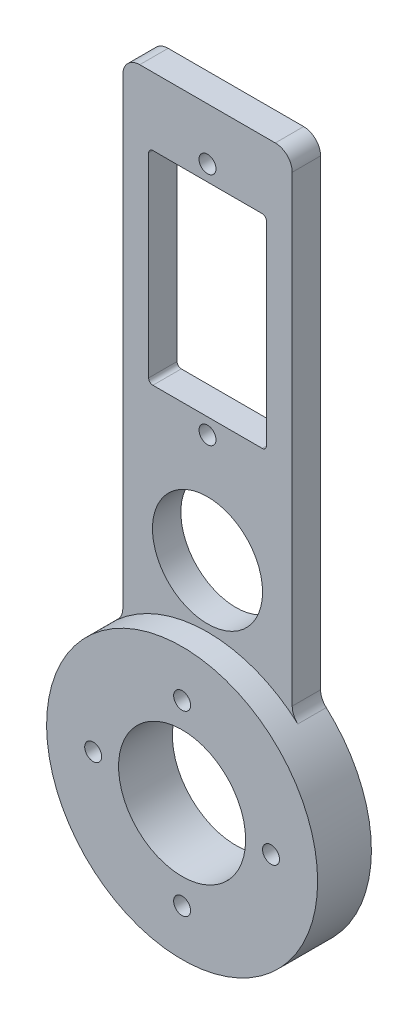
ISO-10303-21;
HEADER;
FILE_DESCRIPTION(('STEP AP214'),'2;1');
FILE_NAME('part.step','',(''),(''),'','','');
FILE_SCHEMA(('AUTOMOTIVE_DESIGN { 1 0 10303 214 1 1 1 1 }'));
ENDSEC;
DATA;
#1=APPLICATION_CONTEXT('core data for automotive mechanical design processes');
#2=APPLICATION_PROTOCOL_DEFINITION('international standard','automotive_design',2000,#1);
#3=PRODUCT_CONTEXT('',#1,'mechanical');
#4=PRODUCT('Part','Part','',(#3));
#5=PRODUCT_RELATED_PRODUCT_CATEGORY('part','',(#4));
#6=PRODUCT_DEFINITION_FORMATION('','',#4);
#7=PRODUCT_DEFINITION_CONTEXT('part definition',#1,'design');
#8=PRODUCT_DEFINITION('design','',#6,#7);
#9=PRODUCT_DEFINITION_SHAPE('','',#8);
#10=(LENGTH_UNIT() NAMED_UNIT(*) SI_UNIT(.MILLI.,.METRE.));
#11=(NAMED_UNIT(*) PLANE_ANGLE_UNIT() SI_UNIT($,.RADIAN.));
#12=(NAMED_UNIT(*) SI_UNIT($,.STERADIAN.) SOLID_ANGLE_UNIT());
#13=UNCERTAINTY_MEASURE_WITH_UNIT(LENGTH_MEASURE(1.E-05),#10,'distance_accuracy_value','');
#14=(GEOMETRIC_REPRESENTATION_CONTEXT(3) GLOBAL_UNCERTAINTY_ASSIGNED_CONTEXT((#13)) GLOBAL_UNIT_ASSIGNED_CONTEXT((#10,
#11,#12)) REPRESENTATION_CONTEXT('',''));
#15=CARTESIAN_POINT('',(0.,0.,0.));
#16=DIRECTION('',(0.,0.,1.));
#17=DIRECTION('',(1.,0.,0.));
#18=AXIS2_PLACEMENT_3D('',#15,#16,#17);
#19=CARTESIAN_POINT('',(0.,0.,6.35));
#20=DIRECTION('',(0.,0.,1.));
#21=DIRECTION('',(1.,0.,0.));
#22=AXIS2_PLACEMENT_3D('',#19,#20,#21);
#23=PLANE('',#22);
#24=CARTESIAN_POINT('',(0.,-10.5,6.35));
#25=DIRECTION('',(0.,0.,1.));
#26=DIRECTION('',(1.,0.,0.));
#27=AXIS2_PLACEMENT_3D('',#24,#25,#26);
#28=CIRCLE('',#27,1.00000000000004);
#29=CARTESIAN_POINT('',(1.00000000000003,-10.5,6.35));
#30=VERTEX_POINT('',#29);
#31=EDGE_CURVE('E353',#30,#30,#28,.T.);
#32=ORIENTED_EDGE('',*,*,#31,.F.);
#33=EDGE_LOOP('',(#32));
#34=FACE_BOUND('',#33,.T.);
#35=CARTESIAN_POINT('',(0.,10.5,6.35));
#36=DIRECTION('',(0.,0.,1.));
#37=DIRECTION('',(1.,0.,0.));
#38=AXIS2_PLACEMENT_3D('',#35,#36,#37);
#39=CIRCLE('',#38,1.00000000000001);
#40=CARTESIAN_POINT('',(1.00000000000001,10.5,6.35));
#41=VERTEX_POINT('',#40);
#42=EDGE_CURVE('E365',#41,#41,#39,.T.);
#43=ORIENTED_EDGE('',*,*,#42,.F.);
#44=EDGE_LOOP('',(#43));
#45=FACE_BOUND('',#44,.T.);
#46=CARTESIAN_POINT('',(-10.5,0.,6.35));
#47=DIRECTION('',(0.,0.,1.));
#48=DIRECTION('',(1.,0.,0.));
#49=AXIS2_PLACEMENT_3D('',#46,#47,#48);
#50=CIRCLE('',#49,1.);
#51=CARTESIAN_POINT('',(-9.5,0.,6.35));
#52=VERTEX_POINT('',#51);
#53=EDGE_CURVE('E359',#52,#52,#50,.T.);
#54=ORIENTED_EDGE('',*,*,#53,.F.);
#55=EDGE_LOOP('',(#54));
#56=FACE_BOUND('',#55,.T.);
#57=CARTESIAN_POINT('',(10.5,0.,6.35));
#58=DIRECTION('',(0.,0.,1.));
#59=DIRECTION('',(1.,0.,0.));
#60=AXIS2_PLACEMENT_3D('',#57,#58,#59);
#61=CIRCLE('',#60,1.);
#62=CARTESIAN_POINT('',(11.5,0.,6.35));
#63=VERTEX_POINT('',#62);
#64=EDGE_CURVE('E347',#63,#63,#61,.T.);
#65=ORIENTED_EDGE('',*,*,#64,.F.);
#66=EDGE_LOOP('',(#65));
#67=FACE_BOUND('',#66,.T.);
#68=CARTESIAN_POINT('',(0.,0.,6.35));
#69=DIRECTION('',(0.,0.,1.));
#70=DIRECTION('',(1.,0.,0.));
#71=AXIS2_PLACEMENT_3D('',#68,#69,#70);
#72=CIRCLE('',#71,7.5);
#73=CARTESIAN_POINT('',(7.5,0.,6.35));
#74=VERTEX_POINT('',#73);
#75=EDGE_CURVE('E320',#74,#74,#72,.T.);
#76=ORIENTED_EDGE('',*,*,#75,.F.);
#77=EDGE_LOOP('',(#76));
#78=FACE_BOUND('',#77,.T.);
#79=CARTESIAN_POINT('',(0.,0.,6.35));
#80=DIRECTION('',(0.,0.,1.));
#81=DIRECTION('',(1.,0.,0.));
#82=AXIS2_PLACEMENT_3D('',#79,#80,#81);
#83=CIRCLE('',#82,16.);
#84=CARTESIAN_POINT('',(16.,0.,6.35));
#85=VERTEX_POINT('',#84);
#86=EDGE_CURVE('E294',#85,#85,#83,.T.);
#87=ORIENTED_EDGE('',*,*,#86,.T.);
#88=EDGE_LOOP('',(#87));
#89=FACE_BOUND('',#88,.T.);
#90=ADVANCED_FACE('F94',(#34,#45,#56,#67,#78,#89),#23,.T.);
#91=CARTESIAN_POINT('',(10.,70.,6.35));
#92=DIRECTION('',(1.,0.,0.));
#93=DIRECTION('',(0.,1.,0.));
#94=AXIS2_PLACEMENT_3D('',#91,#92,#93);
#95=PLANE('',#94);
#96=DIRECTION('',(0.,0.,-1.));
#97=VECTOR('',#96,1.);
#98=CARTESIAN_POINT('',(10.,68.,6.35));
#99=LINE('',#98,#97);
#100=CARTESIAN_POINT('',(10.,68.,0.));
#101=VERTEX_POINT('',#100);
#102=CARTESIAN_POINT('',(10.,68.,3.35));
#103=VERTEX_POINT('',#102);
#104=EDGE_CURVE('E263',#101,#103,#99,.F.);
#105=ORIENTED_EDGE('',*,*,#104,.T.);
#106=DIRECTION('',(0.,1.,0.));
#107=VECTOR('',#106,1.);
#108=CARTESIAN_POINT('',(10.,0.,3.35));
#109=LINE('',#108,#107);
#110=CARTESIAN_POINT('',(10.,13.4164078649988,3.35));
#111=VERTEX_POINT('',#110);
#112=EDGE_CURVE('E310',#111,#103,#109,.T.);
#113=ORIENTED_EDGE('',*,*,#112,.F.);
#114=DIRECTION('',(0.,0.,-1.));
#115=VECTOR('',#114,1.);
#116=CARTESIAN_POINT('',(10.,13.4164078649987,6.35));
#117=LINE('',#116,#115);
#118=CARTESIAN_POINT('',(10.,13.4164078649988,0.));
#119=VERTEX_POINT('',#118);
#120=EDGE_CURVE('E261',#111,#119,#117,.T.);
#121=ORIENTED_EDGE('',*,*,#120,.T.);
#122=DIRECTION('',(0.,-1.,0.));
#123=VECTOR('',#122,1.);
#124=CARTESIAN_POINT('',(10.,70.,0.));
#125=LINE('',#124,#123);
#126=EDGE_CURVE('E374',#101,#119,#125,.T.);
#127=ORIENTED_EDGE('',*,*,#126,.F.);
#128=EDGE_LOOP('',(#105,#113,#121,#127));
#129=FACE_BOUND('',#128,.T.);
#130=ADVANCED_FACE('F436',(#129),#95,.T.);
#131=CARTESIAN_POINT('',(-10.,70.,6.35));
#132=DIRECTION('',(0.,1.,0.));
#133=DIRECTION('',(0.,0.,1.));
#134=AXIS2_PLACEMENT_3D('',#131,#132,#133);
#135=PLANE('',#134);
#136=DIRECTION('',(0.,0.,-1.));
#137=VECTOR('',#136,1.);
#138=CARTESIAN_POINT('',(-8.,70.,6.35));
#139=LINE('',#138,#137);
#140=CARTESIAN_POINT('',(-8.,70.,0.));
#141=VERTEX_POINT('',#140);
#142=CARTESIAN_POINT('',(-8.,70.,3.35));
#143=VERTEX_POINT('',#142);
#144=EDGE_CURVE('E252',#141,#143,#139,.F.);
#145=ORIENTED_EDGE('',*,*,#144,.T.);
#146=DIRECTION('',(-1.,0.,0.));
#147=VECTOR('',#146,1.);
#148=CARTESIAN_POINT('',(0.,70.,3.35));
#149=LINE('',#148,#147);
#150=CARTESIAN_POINT('',(8.,70.,3.35));
#151=VERTEX_POINT('',#150);
#152=EDGE_CURVE('E314',#151,#143,#149,.T.);
#153=ORIENTED_EDGE('',*,*,#152,.F.);
#154=DIRECTION('',(0.,0.,-1.));
#155=VECTOR('',#154,1.);
#156=CARTESIAN_POINT('',(8.,70.,6.35));
#157=LINE('',#156,#155);
#158=CARTESIAN_POINT('',(8.,70.,0.));
#159=VERTEX_POINT('',#158);
#160=EDGE_CURVE('E255',#151,#159,#157,.T.);
#161=ORIENTED_EDGE('',*,*,#160,.T.);
#162=DIRECTION('',(1.,0.,0.));
#163=VECTOR('',#162,1.);
#164=CARTESIAN_POINT('',(-10.,70.,0.));
#165=LINE('',#164,#163);
#166=EDGE_CURVE('E295',#141,#159,#165,.T.);
#167=ORIENTED_EDGE('',*,*,#166,.F.);
#168=EDGE_LOOP('',(#145,#153,#161,#167));
#169=FACE_BOUND('',#168,.T.);
#170=ADVANCED_FACE('F442',(#169),#135,.T.);
#171=CARTESIAN_POINT('',(-10.,12.4899959967968,6.35));
#172=DIRECTION('',(-1.,0.,0.));
#173=DIRECTION('',(0.,-1.,0.));
#174=AXIS2_PLACEMENT_3D('',#171,#172,#173);
#175=PLANE('',#174);
#176=DIRECTION('',(0.,0.,-1.));
#177=VECTOR('',#176,1.);
#178=CARTESIAN_POINT('',(-10.,13.4164078649987,6.35));
#179=LINE('',#178,#177);
#180=CARTESIAN_POINT('',(-10.,13.4164078649987,0.));
#181=VERTEX_POINT('',#180);
#182=CARTESIAN_POINT('',(-10.,13.4164078649987,3.35));
#183=VERTEX_POINT('',#182);
#184=EDGE_CURVE('E266',#181,#183,#179,.F.);
#185=ORIENTED_EDGE('',*,*,#184,.T.);
#186=DIRECTION('',(0.,-1.,0.));
#187=VECTOR('',#186,1.);
#188=CARTESIAN_POINT('',(-10.,0.,3.35));
#189=LINE('',#188,#187);
#190=CARTESIAN_POINT('',(-10.,68.,3.35));
#191=VERTEX_POINT('',#190);
#192=EDGE_CURVE('E318',#191,#183,#189,.T.);
#193=ORIENTED_EDGE('',*,*,#192,.F.);
#194=DIRECTION('',(0.,0.,-1.));
#195=VECTOR('',#194,1.);
#196=CARTESIAN_POINT('',(-10.,68.,6.35));
#197=LINE('',#196,#195);
#198=CARTESIAN_POINT('',(-10.,68.,0.));
#199=VERTEX_POINT('',#198);
#200=EDGE_CURVE('E269',#191,#199,#197,.T.);
#201=ORIENTED_EDGE('',*,*,#200,.T.);
#202=DIRECTION('',(0.,1.,0.));
#203=VECTOR('',#202,1.);
#204=CARTESIAN_POINT('',(-10.,12.4899959967968,0.));
#205=LINE('',#204,#203);
#206=EDGE_CURVE('E283',#181,#199,#205,.T.);
#207=ORIENTED_EDGE('',*,*,#206,.F.);
#208=EDGE_LOOP('',(#185,#193,#201,#207));
#209=FACE_BOUND('',#208,.T.);
#210=ADVANCED_FACE('F290',(#209),#175,.T.);
#211=CARTESIAN_POINT('',(6.95,38.,0.));
#212=DIRECTION('',(0.,1.,0.));
#213=DIRECTION('',(0.,0.,1.));
#214=AXIS2_PLACEMENT_3D('',#211,#212,#213);
#215=PLANE('',#214);
#216=DIRECTION('',(0.,0.,1.));
#217=VECTOR('',#216,1.);
#218=CARTESIAN_POINT('',(-6.45,38.,6.35));
#219=LINE('',#218,#217);
#220=CARTESIAN_POINT('',(-6.45,38.,0.));
#221=VERTEX_POINT('',#220);
#222=CARTESIAN_POINT('',(-6.45,38.,3.35));
#223=VERTEX_POINT('',#222);
#224=EDGE_CURVE('E230',#221,#223,#219,.T.);
#225=ORIENTED_EDGE('',*,*,#224,.T.);
#226=DIRECTION('',(-1.,0.,0.));
#227=VECTOR('',#226,1.);
#228=CARTESIAN_POINT('',(0.,38.,3.35));
#229=LINE('',#228,#227);
#230=CARTESIAN_POINT('',(6.45,38.,3.35));
#231=VERTEX_POINT('',#230);
#232=EDGE_CURVE('E402',#231,#223,#229,.T.);
#233=ORIENTED_EDGE('',*,*,#232,.F.);
#234=DIRECTION('',(0.,0.,1.));
#235=VECTOR('',#234,1.);
#236=CARTESIAN_POINT('',(6.45,38.,0.));
#237=LINE('',#236,#235);
#238=CARTESIAN_POINT('',(6.45,38.,0.));
#239=VERTEX_POINT('',#238);
#240=EDGE_CURVE('E233',#231,#239,#237,.F.);
#241=ORIENTED_EDGE('',*,*,#240,.T.);
#242=DIRECTION('',(-1.,0.,0.));
#243=VECTOR('',#242,1.);
#244=CARTESIAN_POINT('',(6.95,38.,0.));
#245=LINE('',#244,#243);
#246=EDGE_CURVE('E337',#239,#221,#245,.T.);
#247=ORIENTED_EDGE('',*,*,#246,.T.);
#248=EDGE_LOOP('',(#225,#233,#241,#247));
#249=FACE_BOUND('',#248,.T.);
#250=ADVANCED_FACE('F401',(#249),#215,.T.);
#251=CARTESIAN_POINT('',(-6.95,38.,0.));
#252=DIRECTION('',(1.,0.,0.));
#253=DIRECTION('',(0.,0.,-1.));
#254=AXIS2_PLACEMENT_3D('',#251,#252,#253);
#255=PLANE('',#254);
#256=DIRECTION('',(0.,0.,1.));
#257=VECTOR('',#256,1.);
#258=CARTESIAN_POINT('',(-6.95,61.5,0.));
#259=LINE('',#258,#257);
#260=CARTESIAN_POINT('',(-6.95,61.5,0.));
#261=VERTEX_POINT('',#260);
#262=CARTESIAN_POINT('',(-6.95,61.5,3.35));
#263=VERTEX_POINT('',#262);
#264=EDGE_CURVE('E240',#261,#263,#259,.T.);
#265=ORIENTED_EDGE('',*,*,#264,.T.);
#266=DIRECTION('',(0.,1.,0.));
#267=VECTOR('',#266,1.);
#268=CARTESIAN_POINT('',(-6.95,0.,3.35));
#269=LINE('',#268,#267);
#270=CARTESIAN_POINT('',(-6.95,38.5,3.35));
#271=VERTEX_POINT('',#270);
#272=EDGE_CURVE('E109',#271,#263,#269,.T.);
#273=ORIENTED_EDGE('',*,*,#272,.F.);
#274=DIRECTION('',(0.,0.,1.));
#275=VECTOR('',#274,1.);
#276=CARTESIAN_POINT('',(-6.95,38.5,0.));
#277=LINE('',#276,#275);
#278=CARTESIAN_POINT('',(-6.95,38.5,0.));
#279=VERTEX_POINT('',#278);
#280=EDGE_CURVE('E243',#271,#279,#277,.F.);
#281=ORIENTED_EDGE('',*,*,#280,.T.);
#282=DIRECTION('',(0.,1.,0.));
#283=VECTOR('',#282,1.);
#284=CARTESIAN_POINT('',(-6.95,38.,0.));
#285=LINE('',#284,#283);
#286=EDGE_CURVE('E342',#279,#261,#285,.T.);
#287=ORIENTED_EDGE('',*,*,#286,.T.);
#288=EDGE_LOOP('',(#265,#273,#281,#287));
#289=FACE_BOUND('',#288,.T.);
#290=ADVANCED_FACE('F391',(#289),#255,.T.);
#291=CARTESIAN_POINT('',(6.95,62.,0.));
#292=DIRECTION('',(0.,1.,0.));
#293=DIRECTION('',(-1.,0.,0.));
#294=AXIS2_PLACEMENT_3D('',#291,#292,#293);
#295=PLANE('',#294);
#296=DIRECTION('',(1.,0.,0.));
#297=VECTOR('',#296,1.);
#298=CARTESIAN_POINT('',(0.,62.,3.35));
#299=LINE('',#298,#297);
#300=CARTESIAN_POINT('',(-6.45,62.,3.35));
#301=VERTEX_POINT('',#300);
#302=CARTESIAN_POINT('',(6.45,62.,3.35));
#303=VERTEX_POINT('',#302);
#304=EDGE_CURVE('E211',#301,#303,#299,.T.);
#305=ORIENTED_EDGE('',*,*,#304,.F.);
#306=DIRECTION('',(0.,0.,1.));
#307=VECTOR('',#306,1.);
#308=CARTESIAN_POINT('',(-6.45,62.,0.));
#309=LINE('',#308,#307);
#310=CARTESIAN_POINT('',(-6.45,62.,0.));
#311=VERTEX_POINT('',#310);
#312=EDGE_CURVE('E372',#301,#311,#309,.F.);
#313=ORIENTED_EDGE('',*,*,#312,.T.);
#314=DIRECTION('',(-1.,0.,0.));
#315=VECTOR('',#314,1.);
#316=CARTESIAN_POINT('',(6.95,62.,0.));
#317=LINE('',#316,#315);
#318=CARTESIAN_POINT('',(6.45,62.,0.));
#319=VERTEX_POINT('',#318);
#320=EDGE_CURVE('E339',#319,#311,#317,.T.);
#321=ORIENTED_EDGE('',*,*,#320,.F.);
#322=DIRECTION('',(0.,0.,1.));
#323=VECTOR('',#322,1.);
#324=CARTESIAN_POINT('',(6.45,62.,6.35));
#325=LINE('',#324,#323);
#326=EDGE_CURVE('E235',#319,#303,#325,.T.);
#327=ORIENTED_EDGE('',*,*,#326,.T.);
#328=EDGE_LOOP('',(#305,#313,#321,#327));
#329=FACE_BOUND('',#328,.T.);
#330=ADVANCED_FACE('F380',(#329),#295,.F.);
#331=CARTESIAN_POINT('',(6.95,38.,0.));
#332=DIRECTION('',(1.,0.,0.));
#333=DIRECTION('',(0.,0.,-1.));
#334=AXIS2_PLACEMENT_3D('',#331,#332,#333);
#335=PLANE('',#334);
#336=DIRECTION('',(0.,-1.,0.));
#337=VECTOR('',#336,1.);
#338=CARTESIAN_POINT('',(6.95,0.,3.35));
#339=LINE('',#338,#337);
#340=CARTESIAN_POINT('',(6.95,61.5,3.35));
#341=VERTEX_POINT('',#340);
#342=CARTESIAN_POINT('',(6.95,38.5,3.35));
#343=VERTEX_POINT('',#342);
#344=EDGE_CURVE('E208',#341,#343,#339,.T.);
#345=ORIENTED_EDGE('',*,*,#344,.F.);
#346=DIRECTION('',(0.,0.,1.));
#347=VECTOR('',#346,1.);
#348=CARTESIAN_POINT('',(6.95,61.5,0.));
#349=LINE('',#348,#347);
#350=CARTESIAN_POINT('',(6.95,61.5,0.));
#351=VERTEX_POINT('',#350);
#352=EDGE_CURVE('E221',#341,#351,#349,.F.);
#353=ORIENTED_EDGE('',*,*,#352,.T.);
#354=DIRECTION('',(0.,1.,0.));
#355=VECTOR('',#354,1.);
#356=CARTESIAN_POINT('',(6.95,38.,0.));
#357=LINE('',#356,#355);
#358=CARTESIAN_POINT('',(6.95,38.5,0.));
#359=VERTEX_POINT('',#358);
#360=EDGE_CURVE('E329',#359,#351,#357,.T.);
#361=ORIENTED_EDGE('',*,*,#360,.F.);
#362=DIRECTION('',(0.,0.,1.));
#363=VECTOR('',#362,1.);
#364=CARTESIAN_POINT('',(6.95,38.5,0.));
#365=LINE('',#364,#363);
#366=EDGE_CURVE('E224',#359,#343,#365,.T.);
#367=ORIENTED_EDGE('',*,*,#366,.T.);
#368=EDGE_LOOP('',(#345,#353,#361,#367));
#369=FACE_BOUND('',#368,.T.);
#370=ADVANCED_FACE('F219',(#369),#335,.F.);
#371=CARTESIAN_POINT('',(0.,36.15,0.));
#372=DIRECTION('',(0.,0.,1.));
#373=DIRECTION('',(1.,0.,0.));
#374=AXIS2_PLACEMENT_3D('',#371,#372,#373);
#375=CYLINDRICAL_SURFACE('',#374,1.);
#376=CARTESIAN_POINT('',(0.,36.15,0.));
#377=DIRECTION('',(0.,0.,1.));
#378=DIRECTION('',(1.,0.,0.));
#379=AXIS2_PLACEMENT_3D('',#376,#377,#378);
#380=CIRCLE('',#379,1.);
#381=CARTESIAN_POINT('',(1.,36.15,0.));
#382=VERTEX_POINT('',#381);
#383=EDGE_CURVE('E334',#382,#382,#380,.T.);
#384=ORIENTED_EDGE('',*,*,#383,.F.);
#385=EDGE_LOOP('',(#384));
#386=FACE_BOUND('',#385,.T.);
#387=CARTESIAN_POINT('',(0.,36.15,3.35));
#388=DIRECTION('',(0.,0.,1.));
#389=DIRECTION('',(1.,0.,0.));
#390=AXIS2_PLACEMENT_3D('',#387,#388,#389);
#391=CIRCLE('',#390,1.);
#392=CARTESIAN_POINT('',(1.,36.15,3.35));
#393=VERTEX_POINT('',#392);
#394=EDGE_CURVE('E305',#393,#393,#391,.F.);
#395=ORIENTED_EDGE('',*,*,#394,.F.);
#396=EDGE_LOOP('',(#395));
#397=FACE_BOUND('',#396,.T.);
#398=ADVANCED_FACE('F421',(#386,#397),#375,.F.);
#399=CARTESIAN_POINT('',(0.,63.85,0.));
#400=DIRECTION('',(0.,0.,1.));
#401=DIRECTION('',(1.,0.,0.));
#402=AXIS2_PLACEMENT_3D('',#399,#400,#401);
#403=CYLINDRICAL_SURFACE('',#402,1.);
#404=CARTESIAN_POINT('',(0.,63.85,0.));
#405=DIRECTION('',(0.,0.,1.));
#406=DIRECTION('',(1.,0.,0.));
#407=AXIS2_PLACEMENT_3D('',#404,#405,#406);
#408=CIRCLE('',#407,1.);
#409=CARTESIAN_POINT('',(1.,63.85,0.));
#410=VERTEX_POINT('',#409);
#411=EDGE_CURVE('E330',#410,#410,#408,.F.);
#412=ORIENTED_EDGE('',*,*,#411,.T.);
#413=EDGE_LOOP('',(#412));
#414=FACE_BOUND('',#413,.T.);
#415=CARTESIAN_POINT('',(0.,63.85,3.35));
#416=DIRECTION('',(0.,0.,1.));
#417=DIRECTION('',(1.,0.,0.));
#418=AXIS2_PLACEMENT_3D('',#415,#416,#417);
#419=CIRCLE('',#418,1.);
#420=CARTESIAN_POINT('',(1.,63.85,3.35));
#421=VERTEX_POINT('',#420);
#422=EDGE_CURVE('E414',#421,#421,#419,.F.);
#423=ORIENTED_EDGE('',*,*,#422,.F.);
#424=EDGE_LOOP('',(#423));
#425=FACE_BOUND('',#424,.T.);
#426=ADVANCED_FACE('F423',(#414,#425),#403,.F.);
#427=CARTESIAN_POINT('',(6.45,61.5,0.));
#428=DIRECTION('',(0.,0.,-1.));
#429=DIRECTION('',(-1.,0.,0.));
#430=AXIS2_PLACEMENT_3D('',#427,#428,#429);
#431=CYLINDRICAL_SURFACE('',#430,0.5);
#432=CARTESIAN_POINT('',(6.45,61.5,3.35));
#433=DIRECTION('',(0.,0.,1.));
#434=DIRECTION('',(1.,0.,0.));
#435=AXIS2_PLACEMENT_3D('',#432,#433,#434);
#436=CIRCLE('',#435,0.5);
#437=EDGE_CURVE('E204',#303,#341,#436,.F.);
#438=ORIENTED_EDGE('',*,*,#437,.F.);
#439=ORIENTED_EDGE('',*,*,#326,.F.);
#440=CARTESIAN_POINT('',(6.45,61.5,0.));
#441=DIRECTION('',(0.,0.,1.));
#442=DIRECTION('',(1.,0.,0.));
#443=AXIS2_PLACEMENT_3D('',#440,#441,#442);
#444=CIRCLE('',#443,0.5);
#445=EDGE_CURVE('E229',#351,#319,#444,.T.);
#446=ORIENTED_EDGE('',*,*,#445,.F.);
#447=ORIENTED_EDGE('',*,*,#352,.F.);
#448=EDGE_LOOP('',(#438,#439,#446,#447));
#449=FACE_BOUND('',#448,.T.);
#450=ADVANCED_FACE('F228',(#449),#431,.F.);
#451=CARTESIAN_POINT('',(6.45,38.5,0.));
#452=DIRECTION('',(0.,0.,1.));
#453=DIRECTION('',(1.,0.,0.));
#454=AXIS2_PLACEMENT_3D('',#451,#452,#453);
#455=CYLINDRICAL_SURFACE('',#454,0.5);
#456=CARTESIAN_POINT('',(6.45,38.5,3.35));
#457=DIRECTION('',(0.,0.,1.));
#458=DIRECTION('',(1.,0.,0.));
#459=AXIS2_PLACEMENT_3D('',#456,#457,#458);
#460=CIRCLE('',#459,0.5);
#461=EDGE_CURVE('E225',#343,#231,#460,.F.);
#462=ORIENTED_EDGE('',*,*,#461,.F.);
#463=ORIENTED_EDGE('',*,*,#366,.F.);
#464=CARTESIAN_POINT('',(6.45,38.5,0.));
#465=DIRECTION('',(0.,0.,1.));
#466=DIRECTION('',(1.,0.,0.));
#467=AXIS2_PLACEMENT_3D('',#464,#465,#466);
#468=CIRCLE('',#467,0.5);
#469=EDGE_CURVE('E246',#239,#359,#468,.T.);
#470=ORIENTED_EDGE('',*,*,#469,.F.);
#471=ORIENTED_EDGE('',*,*,#240,.F.);
#472=EDGE_LOOP('',(#462,#463,#470,#471));
#473=FACE_BOUND('',#472,.T.);
#474=ADVANCED_FACE('F406',(#473),#455,.F.);
#475=CARTESIAN_POINT('',(-6.45,38.5,0.));
#476=DIRECTION('',(0.,0.,-1.));
#477=DIRECTION('',(-1.,0.,0.));
#478=AXIS2_PLACEMENT_3D('',#475,#476,#477);
#479=CYLINDRICAL_SURFACE('',#478,0.5);
#480=CARTESIAN_POINT('',(-6.45,38.5,3.35));
#481=DIRECTION('',(0.,0.,1.));
#482=DIRECTION('',(1.,0.,0.));
#483=AXIS2_PLACEMENT_3D('',#480,#481,#482);
#484=CIRCLE('',#483,0.5);
#485=EDGE_CURVE('E398',#223,#271,#484,.F.);
#486=ORIENTED_EDGE('',*,*,#485,.F.);
#487=ORIENTED_EDGE('',*,*,#224,.F.);
#488=CARTESIAN_POINT('',(-6.45,38.5,0.));
#489=DIRECTION('',(0.,0.,1.));
#490=DIRECTION('',(1.,0.,0.));
#491=AXIS2_PLACEMENT_3D('',#488,#489,#490);
#492=CIRCLE('',#491,0.5);
#493=EDGE_CURVE('E248',#279,#221,#492,.T.);
#494=ORIENTED_EDGE('',*,*,#493,.F.);
#495=ORIENTED_EDGE('',*,*,#280,.F.);
#496=EDGE_LOOP('',(#486,#487,#494,#495));
#497=FACE_BOUND('',#496,.T.);
#498=ADVANCED_FACE('F397',(#497),#479,.F.);
#499=CARTESIAN_POINT('',(-6.45,61.5,0.));
#500=DIRECTION('',(0.,0.,1.));
#501=DIRECTION('',(1.,0.,0.));
#502=AXIS2_PLACEMENT_3D('',#499,#500,#501);
#503=CYLINDRICAL_SURFACE('',#502,0.5);
#504=CARTESIAN_POINT('',(-6.45,61.5,3.35));
#505=DIRECTION('',(0.,0.,1.));
#506=DIRECTION('',(1.,0.,0.));
#507=AXIS2_PLACEMENT_3D('',#504,#505,#506);
#508=CIRCLE('',#507,0.5);
#509=EDGE_CURVE('E389',#263,#301,#508,.F.);
#510=ORIENTED_EDGE('',*,*,#509,.F.);
#511=ORIENTED_EDGE('',*,*,#264,.F.);
#512=CARTESIAN_POINT('',(-6.45,61.5,0.));
#513=DIRECTION('',(0.,0.,1.));
#514=DIRECTION('',(1.,0.,0.));
#515=AXIS2_PLACEMENT_3D('',#512,#513,#514);
#516=CIRCLE('',#515,0.5);
#517=EDGE_CURVE('E250',#311,#261,#516,.T.);
#518=ORIENTED_EDGE('',*,*,#517,.F.);
#519=ORIENTED_EDGE('',*,*,#312,.F.);
#520=EDGE_LOOP('',(#510,#511,#518,#519));
#521=FACE_BOUND('',#520,.T.);
#522=ADVANCED_FACE('F388',(#521),#503,.F.);
#523=CARTESIAN_POINT('',(8.,68.,6.35));
#524=DIRECTION('',(0.,0.,-1.));
#525=DIRECTION('',(-1.,0.,0.));
#526=AXIS2_PLACEMENT_3D('',#523,#524,#525);
#527=CYLINDRICAL_SURFACE('',#526,2.);
#528=ORIENTED_EDGE('',*,*,#160,.F.);
#529=CARTESIAN_POINT('',(8.,68.,3.35));
#530=DIRECTION('',(0.,0.,1.));
#531=DIRECTION('',(1.,0.,0.));
#532=AXIS2_PLACEMENT_3D('',#529,#530,#531);
#533=CIRCLE('',#532,2.);
#534=EDGE_CURVE('E312',#103,#151,#533,.T.);
#535=ORIENTED_EDGE('',*,*,#534,.F.);
#536=ORIENTED_EDGE('',*,*,#104,.F.);
#537=CARTESIAN_POINT('',(8.,68.,0.));
#538=DIRECTION('',(0.,0.,1.));
#539=DIRECTION('',(1.,0.,0.));
#540=AXIS2_PLACEMENT_3D('',#537,#538,#539);
#541=CIRCLE('',#540,2.);
#542=EDGE_CURVE('E259',#159,#101,#541,.F.);
#543=ORIENTED_EDGE('',*,*,#542,.F.);
#544=EDGE_LOOP('',(#528,#535,#536,#543));
#545=FACE_BOUND('',#544,.T.);
#546=ADVANCED_FACE('F472',(#545),#527,.T.);
#547=CARTESIAN_POINT('',(-8.,68.,6.35));
#548=DIRECTION('',(0.,0.,-1.));
#549=DIRECTION('',(-1.,0.,0.));
#550=AXIS2_PLACEMENT_3D('',#547,#548,#549);
#551=CYLINDRICAL_SURFACE('',#550,2.);
#552=ORIENTED_EDGE('',*,*,#200,.F.);
#553=CARTESIAN_POINT('',(-8.,68.,3.35));
#554=DIRECTION('',(0.,0.,1.));
#555=DIRECTION('',(1.,0.,0.));
#556=AXIS2_PLACEMENT_3D('',#553,#554,#555);
#557=CIRCLE('',#556,2.);
#558=EDGE_CURVE('E316',#143,#191,#557,.T.);
#559=ORIENTED_EDGE('',*,*,#558,.F.);
#560=ORIENTED_EDGE('',*,*,#144,.F.);
#561=CARTESIAN_POINT('',(-8.,68.,0.));
#562=DIRECTION('',(0.,0.,1.));
#563=DIRECTION('',(1.,0.,0.));
#564=AXIS2_PLACEMENT_3D('',#561,#562,#563);
#565=CIRCLE('',#564,2.);
#566=EDGE_CURVE('E257',#199,#141,#565,.F.);
#567=ORIENTED_EDGE('',*,*,#566,.F.);
#568=EDGE_LOOP('',(#552,#559,#560,#567));
#569=FACE_BOUND('',#568,.T.);
#570=ADVANCED_FACE('F475',(#569),#551,.T.);
#571=CARTESIAN_POINT('',(-12.,13.4164078649987,6.35));
#572=DIRECTION('',(0.,0.,-1.));
#573=DIRECTION('',(-1.,0.,0.));
#574=AXIS2_PLACEMENT_3D('',#571,#572,#573);
#575=CYLINDRICAL_SURFACE('',#574,2.);
#576=CARTESIAN_POINT('',(-12.,13.4164078649987,3.35));
#577=DIRECTION('',(0.,0.,1.));
#578=DIRECTION('',(1.,0.,0.));
#579=AXIS2_PLACEMENT_3D('',#576,#577,#578);
#580=CIRCLE('',#579,2.);
#581=CARTESIAN_POINT('',(-10.6666666666667,11.9256958799989,3.35));
#582=VERTEX_POINT('',#581);
#583=EDGE_CURVE('E299',#183,#582,#580,.F.);
#584=ORIENTED_EDGE('',*,*,#583,.F.);
#585=ORIENTED_EDGE('',*,*,#184,.F.);
#586=CARTESIAN_POINT('',(-12.,13.4164078649987,0.));
#587=DIRECTION('',(0.,0.,1.));
#588=DIRECTION('',(1.,0.,0.));
#589=AXIS2_PLACEMENT_3D('',#586,#587,#588);
#590=CIRCLE('',#589,2.);
#591=CARTESIAN_POINT('',(-10.6666666666667,11.9256958799989,0.));
#592=VERTEX_POINT('',#591);
#593=EDGE_CURVE('E102',#592,#181,#590,.T.);
#594=ORIENTED_EDGE('',*,*,#593,.F.);
#595=DIRECTION('',(0.,0.,-1.));
#596=VECTOR('',#595,1.);
#597=CARTESIAN_POINT('',(-10.6666666666667,11.9256958799989,6.35));
#598=LINE('',#597,#596);
#599=EDGE_CURVE('E274',#582,#592,#598,.T.);
#600=ORIENTED_EDGE('',*,*,#599,.F.);
#601=EDGE_LOOP('',(#584,#585,#594,#600));
#602=FACE_BOUND('',#601,.T.);
#603=ADVANCED_FACE('F298',(#602),#575,.F.);
#604=CARTESIAN_POINT('',(12.,13.4164078649987,6.35));
#605=DIRECTION('',(0.,0.,-1.));
#606=DIRECTION('',(-1.,0.,0.));
#607=AXIS2_PLACEMENT_3D('',#604,#605,#606);
#608=CYLINDRICAL_SURFACE('',#607,2.);
#609=CARTESIAN_POINT('',(12.,13.4164078649987,3.35));
#610=DIRECTION('',(0.,0.,1.));
#611=DIRECTION('',(1.,0.,0.));
#612=AXIS2_PLACEMENT_3D('',#609,#610,#611);
#613=CIRCLE('',#612,2.);
#614=CARTESIAN_POINT('',(10.6666666666667,11.9256958799989,3.35));
#615=VERTEX_POINT('',#614);
#616=EDGE_CURVE('E302',#615,#111,#613,.F.);
#617=ORIENTED_EDGE('',*,*,#616,.F.);
#618=DIRECTION('',(0.,0.,-1.));
#619=VECTOR('',#618,1.);
#620=CARTESIAN_POINT('',(10.6666666666667,11.9256958799989,6.35));
#621=LINE('',#620,#619);
#622=CARTESIAN_POINT('',(10.6666666666667,11.9256958799989,0.));
#623=VERTEX_POINT('',#622);
#624=EDGE_CURVE('E271',#623,#615,#621,.F.);
#625=ORIENTED_EDGE('',*,*,#624,.F.);
#626=CARTESIAN_POINT('',(12.,13.4164078649987,0.));
#627=DIRECTION('',(0.,0.,1.));
#628=DIRECTION('',(1.,0.,0.));
#629=AXIS2_PLACEMENT_3D('',#626,#627,#628);
#630=CIRCLE('',#629,2.);
#631=EDGE_CURVE('E13',#119,#623,#630,.T.);
#632=ORIENTED_EDGE('',*,*,#631,.F.);
#633=ORIENTED_EDGE('',*,*,#120,.F.);
#634=EDGE_LOOP('',(#617,#625,#632,#633));
#635=FACE_BOUND('',#634,.T.);
#636=ADVANCED_FACE('F96',(#635),#608,.F.);
#637=CARTESIAN_POINT('',(0.,23.325,0.));
#638=DIRECTION('',(0.,0.,1.));
#639=DIRECTION('',(1.,0.,0.));
#640=AXIS2_PLACEMENT_3D('',#637,#638,#639);
#641=CYLINDRICAL_SURFACE('',#640,6.5);
#642=CARTESIAN_POINT('',(0.,23.325,0.));
#643=DIRECTION('',(0.,0.,1.));
#644=DIRECTION('',(1.,0.,0.));
#645=AXIS2_PLACEMENT_3D('',#642,#643,#644);
#646=CIRCLE('',#645,6.5);
#647=CARTESIAN_POINT('',(6.5,23.325,0.));
#648=VERTEX_POINT('',#647);
#649=EDGE_CURVE('E324',#648,#648,#646,.T.);
#650=ORIENTED_EDGE('',*,*,#649,.F.);
#651=EDGE_LOOP('',(#650));
#652=FACE_BOUND('',#651,.T.);
#653=CARTESIAN_POINT('',(0.,23.325,3.35));
#654=DIRECTION('',(0.,0.,1.));
#655=DIRECTION('',(1.,0.,0.));
#656=AXIS2_PLACEMENT_3D('',#653,#654,#655);
#657=CIRCLE('',#656,6.5);
#658=CARTESIAN_POINT('',(6.5,23.325,3.35));
#659=VERTEX_POINT('',#658);
#660=EDGE_CURVE('E300',#659,#659,#657,.F.);
#661=ORIENTED_EDGE('',*,*,#660,.F.);
#662=EDGE_LOOP('',(#661));
#663=FACE_BOUND('',#662,.T.);
#664=ADVANCED_FACE('F454',(#652,#663),#641,.F.);
#665=CARTESIAN_POINT('',(0.,0.,0.));
#666=DIRECTION('',(0.,0.,1.));
#667=DIRECTION('',(1.,0.,0.));
#668=AXIS2_PLACEMENT_3D('',#665,#666,#667);
#669=PLANE('',#668);
#670=CARTESIAN_POINT('',(0.,0.,0.));
#671=DIRECTION('',(0.,0.,1.));
#672=DIRECTION('',(1.,0.,0.));
#673=AXIS2_PLACEMENT_3D('',#670,#671,#672);
#674=CIRCLE('',#673,7.5);
#675=CARTESIAN_POINT('',(7.5,0.,0.));
#676=VERTEX_POINT('',#675);
#677=EDGE_CURVE('E321',#676,#676,#674,.T.);
#678=ORIENTED_EDGE('',*,*,#677,.T.);
#679=EDGE_LOOP('',(#678));
#680=FACE_BOUND('',#679,.T.);
#681=ORIENTED_EDGE('',*,*,#649,.T.);
#682=EDGE_LOOP('',(#681));
#683=FACE_BOUND('',#682,.T.);
#684=ORIENTED_EDGE('',*,*,#383,.T.);
#685=EDGE_LOOP('',(#684));
#686=FACE_BOUND('',#685,.T.);
#687=CARTESIAN_POINT('',(10.5,0.,0.));
#688=DIRECTION('',(0.,0.,1.));
#689=DIRECTION('',(1.,0.,0.));
#690=AXIS2_PLACEMENT_3D('',#687,#688,#689);
#691=CIRCLE('',#690,1.);
#692=CARTESIAN_POINT('',(11.5,0.,0.));
#693=VERTEX_POINT('',#692);
#694=EDGE_CURVE('E333',#693,#693,#691,.T.);
#695=ORIENTED_EDGE('',*,*,#694,.T.);
#696=EDGE_LOOP('',(#695));
#697=FACE_BOUND('',#696,.T.);
#698=CARTESIAN_POINT('',(0.,-10.5,0.));
#699=DIRECTION('',(0.,0.,1.));
#700=DIRECTION('',(1.,0.,0.));
#701=AXIS2_PLACEMENT_3D('',#698,#699,#700);
#702=CIRCLE('',#701,1.00000000000004);
#703=CARTESIAN_POINT('',(1.00000000000003,-10.5,0.));
#704=VERTEX_POINT('',#703);
#705=EDGE_CURVE('E350',#704,#704,#702,.T.);
#706=ORIENTED_EDGE('',*,*,#705,.T.);
#707=EDGE_LOOP('',(#706));
#708=FACE_BOUND('',#707,.T.);
#709=CARTESIAN_POINT('',(-10.5,0.,0.));
#710=DIRECTION('',(0.,0.,1.));
#711=DIRECTION('',(1.,0.,0.));
#712=AXIS2_PLACEMENT_3D('',#709,#710,#711);
#713=CIRCLE('',#712,1.);
#714=CARTESIAN_POINT('',(-9.5,0.,0.));
#715=VERTEX_POINT('',#714);
#716=EDGE_CURVE('E356',#715,#715,#713,.T.);
#717=ORIENTED_EDGE('',*,*,#716,.T.);
#718=EDGE_LOOP('',(#717));
#719=FACE_BOUND('',#718,.T.);
#720=CARTESIAN_POINT('',(0.,10.5,0.));
#721=DIRECTION('',(0.,0.,1.));
#722=DIRECTION('',(1.,0.,0.));
#723=AXIS2_PLACEMENT_3D('',#720,#721,#722);
#724=CIRCLE('',#723,1.00000000000001);
#725=CARTESIAN_POINT('',(1.00000000000001,10.5,0.));
#726=VERTEX_POINT('',#725);
#727=EDGE_CURVE('E362',#726,#726,#724,.T.);
#728=ORIENTED_EDGE('',*,*,#727,.T.);
#729=EDGE_LOOP('',(#728));
#730=FACE_BOUND('',#729,.T.);
#731=ORIENTED_EDGE('',*,*,#166,.T.);
#732=ORIENTED_EDGE('',*,*,#542,.T.);
#733=ORIENTED_EDGE('',*,*,#126,.T.);
#734=ORIENTED_EDGE('',*,*,#631,.T.);
#735=CARTESIAN_POINT('',(0.,0.,0.));
#736=DIRECTION('',(0.,0.,1.));
#737=DIRECTION('',(1.,0.,0.));
#738=AXIS2_PLACEMENT_3D('',#735,#736,#737);
#739=CIRCLE('',#738,16.);
#740=EDGE_CURVE('E285',#592,#623,#739,.T.);
#741=ORIENTED_EDGE('',*,*,#740,.F.);
#742=ORIENTED_EDGE('',*,*,#593,.T.);
#743=ORIENTED_EDGE('',*,*,#206,.T.);
#744=ORIENTED_EDGE('',*,*,#566,.T.);
#745=EDGE_LOOP('',(#731,#732,#733,#734,#741,#742,#743,#744));
#746=FACE_BOUND('',#745,.T.);
#747=ORIENTED_EDGE('',*,*,#246,.F.);
#748=ORIENTED_EDGE('',*,*,#469,.T.);
#749=ORIENTED_EDGE('',*,*,#360,.T.);
#750=ORIENTED_EDGE('',*,*,#445,.T.);
#751=ORIENTED_EDGE('',*,*,#320,.T.);
#752=ORIENTED_EDGE('',*,*,#517,.T.);
#753=ORIENTED_EDGE('',*,*,#286,.F.);
#754=ORIENTED_EDGE('',*,*,#493,.T.);
#755=EDGE_LOOP('',(#747,#748,#749,#750,#751,#752,#753,#754));
#756=FACE_BOUND('',#755,.T.);
#757=ORIENTED_EDGE('',*,*,#411,.F.);
#758=EDGE_LOOP('',(#757));
#759=FACE_BOUND('',#758,.T.);
#760=ADVANCED_FACE('F281',(#680,#683,#686,#697,#708,#719,#730,#746,#756,#759),#669,.F.);
#761=CARTESIAN_POINT('',(0.,0.,6.35));
#762=DIRECTION('',(0.,0.,-1.));
#763=DIRECTION('',(-1.,0.,0.));
#764=AXIS2_PLACEMENT_3D('',#761,#762,#763);
#765=CYLINDRICAL_SURFACE('',#764,16.);
#766=CARTESIAN_POINT('',(0.,0.,3.35));
#767=DIRECTION('',(0.,0.,1.));
#768=DIRECTION('',(1.,0.,0.));
#769=AXIS2_PLACEMENT_3D('',#766,#767,#768);
#770=CIRCLE('',#769,16.);
#771=EDGE_CURVE('E117',#582,#615,#770,.F.);
#772=ORIENTED_EDGE('',*,*,#771,.F.);
#773=ORIENTED_EDGE('',*,*,#599,.T.);
#774=ORIENTED_EDGE('',*,*,#740,.T.);
#775=ORIENTED_EDGE('',*,*,#624,.T.);
#776=EDGE_LOOP('',(#772,#773,#774,#775));
#777=FACE_BOUND('',#776,.T.);
#778=ORIENTED_EDGE('',*,*,#86,.F.);
#779=EDGE_LOOP('',(#778));
#780=FACE_BOUND('',#779,.T.);
#781=ADVANCED_FACE('F453',(#777,#780),#765,.T.);
#782=CARTESIAN_POINT('',(0.,10.5,6.35));
#783=DIRECTION('',(0.,0.,-1.));
#784=DIRECTION('',(-1.,0.,0.));
#785=AXIS2_PLACEMENT_3D('',#782,#783,#784);
#786=CYLINDRICAL_SURFACE('',#785,1.00000000000001);
#787=ORIENTED_EDGE('',*,*,#42,.T.);
#788=EDGE_LOOP('',(#787));
#789=FACE_BOUND('',#788,.T.);
#790=ORIENTED_EDGE('',*,*,#727,.F.);
#791=EDGE_LOOP('',(#790));
#792=FACE_BOUND('',#791,.T.);
#793=ADVANCED_FACE('F449',(#789,#792),#786,.F.);
#794=CARTESIAN_POINT('',(-10.5,0.,6.35));
#795=DIRECTION('',(0.,0.,-1.));
#796=DIRECTION('',(-1.,0.,0.));
#797=AXIS2_PLACEMENT_3D('',#794,#795,#796);
#798=CYLINDRICAL_SURFACE('',#797,1.);
#799=ORIENTED_EDGE('',*,*,#53,.T.);
#800=EDGE_LOOP('',(#799));
#801=FACE_BOUND('',#800,.T.);
#802=ORIENTED_EDGE('',*,*,#716,.F.);
#803=EDGE_LOOP('',(#802));
#804=FACE_BOUND('',#803,.T.);
#805=ADVANCED_FACE('F537',(#801,#804),#798,.F.);
#806=CARTESIAN_POINT('',(0.,-10.5,6.35));
#807=DIRECTION('',(0.,0.,-1.));
#808=DIRECTION('',(-1.,0.,0.));
#809=AXIS2_PLACEMENT_3D('',#806,#807,#808);
#810=CYLINDRICAL_SURFACE('',#809,1.00000000000004);
#811=ORIENTED_EDGE('',*,*,#31,.T.);
#812=EDGE_LOOP('',(#811));
#813=FACE_BOUND('',#812,.T.);
#814=ORIENTED_EDGE('',*,*,#705,.F.);
#815=EDGE_LOOP('',(#814));
#816=FACE_BOUND('',#815,.T.);
#817=ADVANCED_FACE('F517',(#813,#816),#810,.F.);
#818=CARTESIAN_POINT('',(10.5,0.,6.35));
#819=DIRECTION('',(0.,0.,-1.));
#820=DIRECTION('',(-1.,0.,0.));
#821=AXIS2_PLACEMENT_3D('',#818,#819,#820);
#822=CYLINDRICAL_SURFACE('',#821,1.);
#823=ORIENTED_EDGE('',*,*,#64,.T.);
#824=EDGE_LOOP('',(#823));
#825=FACE_BOUND('',#824,.T.);
#826=ORIENTED_EDGE('',*,*,#694,.F.);
#827=EDGE_LOOP('',(#826));
#828=FACE_BOUND('',#827,.T.);
#829=ADVANCED_FACE('F511',(#825,#828),#822,.F.);
#830=CARTESIAN_POINT('',(0.,0.,0.));
#831=DIRECTION('',(0.,0.,1.));
#832=DIRECTION('',(1.,0.,0.));
#833=AXIS2_PLACEMENT_3D('',#830,#831,#832);
#834=CYLINDRICAL_SURFACE('',#833,7.5);
#835=ORIENTED_EDGE('',*,*,#677,.F.);
#836=EDGE_LOOP('',(#835));
#837=FACE_BOUND('',#836,.T.);
#838=ORIENTED_EDGE('',*,*,#75,.T.);
#839=EDGE_LOOP('',(#838));
#840=FACE_BOUND('',#839,.T.);
#841=ADVANCED_FACE('F506',(#837,#840),#834,.F.);
#842=CARTESIAN_POINT('',(0.,0.,3.35));
#843=DIRECTION('',(0.,0.,1.));
#844=DIRECTION('',(1.,0.,0.));
#845=AXIS2_PLACEMENT_3D('',#842,#843,#844);
#846=PLANE('',#845);
#847=ORIENTED_EDGE('',*,*,#437,.T.);
#848=ORIENTED_EDGE('',*,*,#344,.T.);
#849=ORIENTED_EDGE('',*,*,#461,.T.);
#850=ORIENTED_EDGE('',*,*,#232,.T.);
#851=ORIENTED_EDGE('',*,*,#485,.T.);
#852=ORIENTED_EDGE('',*,*,#272,.T.);
#853=ORIENTED_EDGE('',*,*,#509,.T.);
#854=ORIENTED_EDGE('',*,*,#304,.T.);
#855=EDGE_LOOP('',(#847,#848,#849,#850,#851,#852,#853,#854));
#856=FACE_BOUND('',#855,.T.);
#857=ORIENTED_EDGE('',*,*,#422,.T.);
#858=EDGE_LOOP('',(#857));
#859=FACE_BOUND('',#858,.T.);
#860=ORIENTED_EDGE('',*,*,#394,.T.);
#861=EDGE_LOOP('',(#860));
#862=FACE_BOUND('',#861,.T.);
#863=ORIENTED_EDGE('',*,*,#660,.T.);
#864=EDGE_LOOP('',(#863));
#865=FACE_BOUND('',#864,.T.);
#866=ORIENTED_EDGE('',*,*,#583,.T.);
#867=ORIENTED_EDGE('',*,*,#771,.T.);
#868=ORIENTED_EDGE('',*,*,#616,.T.);
#869=ORIENTED_EDGE('',*,*,#112,.T.);
#870=ORIENTED_EDGE('',*,*,#534,.T.);
#871=ORIENTED_EDGE('',*,*,#152,.T.);
#872=ORIENTED_EDGE('',*,*,#558,.T.);
#873=ORIENTED_EDGE('',*,*,#192,.T.);
#874=EDGE_LOOP('',(#866,#867,#868,#869,#870,#871,#872,#873));
#875=FACE_BOUND('',#874,.T.);
#876=ADVANCED_FACE('F206',(#856,#859,#862,#865,#875),#846,.T.);
#877=CLOSED_SHELL('',(#90,#130,#170,#210,#250,#290,#330,#370,#398,#426,#450,#474,#498,#522,#546,
#570,#603,#636,#664,#760,#781,#793,#805,#817,#829,#841,#876));
#878=MANIFOLD_SOLID_BREP('B2',#877);
#879=ADVANCED_BREP_SHAPE_REPRESENTATION('',(#18,#878),#14);
#880=SHAPE_DEFINITION_REPRESENTATION(#9,#879);
ENDSEC;
END-ISO-10303-21;
